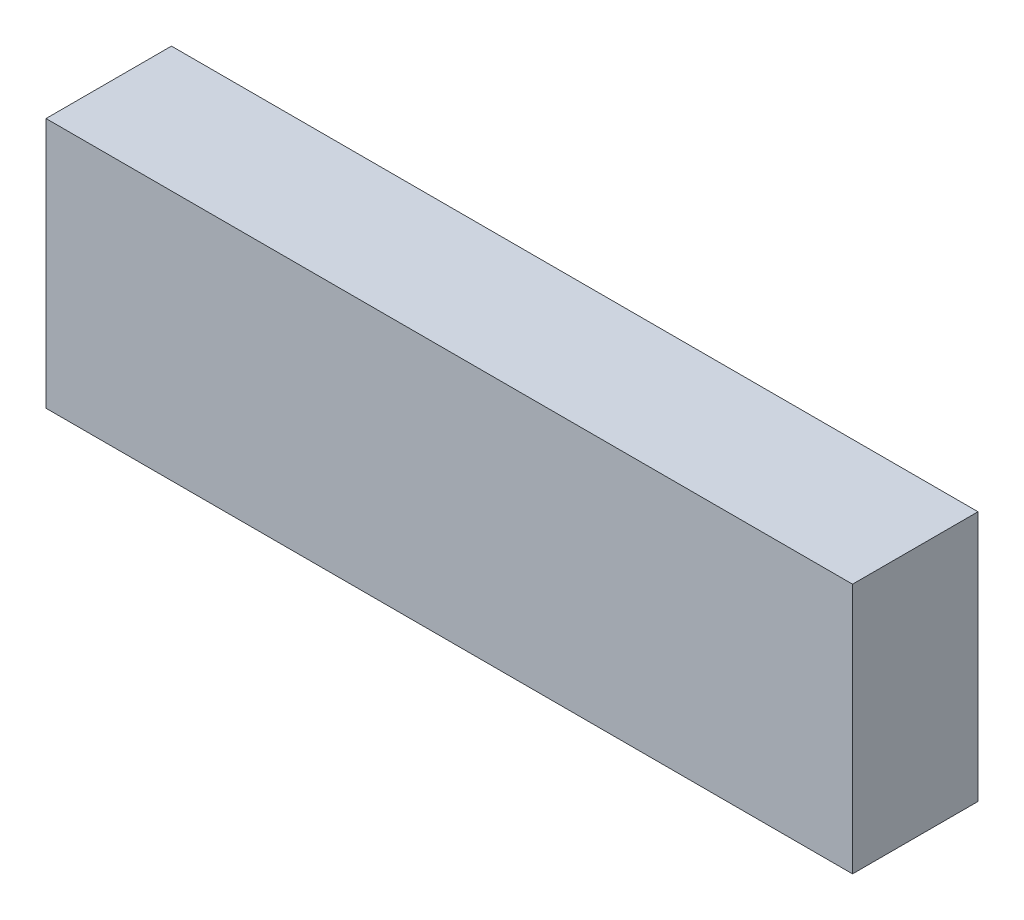
ISO-10303-21;
HEADER;
FILE_DESCRIPTION(('STEP AP214'),'2;1');
FILE_NAME('part.step','',(''),(''),'','','');
FILE_SCHEMA(('AUTOMOTIVE_DESIGN { 1 0 10303 214 1 1 1 1 }'));
ENDSEC;
DATA;
#1=APPLICATION_CONTEXT('core data for automotive mechanical design processes');
#2=APPLICATION_PROTOCOL_DEFINITION('international standard','automotive_design',2000,#1);
#3=PRODUCT_CONTEXT('',#1,'mechanical');
#4=PRODUCT('Part','Part','',(#3));
#5=PRODUCT_RELATED_PRODUCT_CATEGORY('part','',(#4));
#6=PRODUCT_DEFINITION_FORMATION('','',#4);
#7=PRODUCT_DEFINITION_CONTEXT('part definition',#1,'design');
#8=PRODUCT_DEFINITION('design','',#6,#7);
#9=PRODUCT_DEFINITION_SHAPE('','',#8);
#10=(LENGTH_UNIT() NAMED_UNIT(*) SI_UNIT(.MILLI.,.METRE.));
#11=(NAMED_UNIT(*) PLANE_ANGLE_UNIT() SI_UNIT($,.RADIAN.));
#12=(NAMED_UNIT(*) SI_UNIT($,.STERADIAN.) SOLID_ANGLE_UNIT());
#13=UNCERTAINTY_MEASURE_WITH_UNIT(LENGTH_MEASURE(1.E-05),#10,'distance_accuracy_value','');
#14=(GEOMETRIC_REPRESENTATION_CONTEXT(3) GLOBAL_UNCERTAINTY_ASSIGNED_CONTEXT((#13)) GLOBAL_UNIT_ASSIGNED_CONTEXT((#10,
#11,#12)) REPRESENTATION_CONTEXT('',''));
#15=CARTESIAN_POINT('',(0.,0.,0.));
#16=DIRECTION('',(0.,0.,1.));
#17=DIRECTION('',(1.,0.,0.));
#18=AXIS2_PLACEMENT_3D('',#15,#16,#17);
#19=CARTESIAN_POINT('',(-85.,106.,198.));
#20=DIRECTION('',(0.,0.,1.));
#21=DIRECTION('',(1.,0.,0.));
#22=AXIS2_PLACEMENT_3D('',#19,#20,#21);
#23=PLANE('',#22);
#24=DIRECTION('',(0.,1.,0.));
#25=VECTOR('',#24,1.);
#26=CARTESIAN_POINT('',(-85.,106.,198.));
#27=LINE('',#26,#25);
#28=CARTESIAN_POINT('',(-85.,106.,198.));
#29=VERTEX_POINT('',#28);
#30=CARTESIAN_POINT('',(-85.,134.,198.));
#31=VERTEX_POINT('',#30);
#32=EDGE_CURVE('E98',#29,#31,#27,.T.);
#33=ORIENTED_EDGE('',*,*,#32,.F.);
#34=DIRECTION('',(1.,0.,0.));
#35=VECTOR('',#34,1.);
#36=CARTESIAN_POINT('',(-85.,106.,198.));
#37=LINE('',#36,#35);
#38=CARTESIAN_POINT('',(5.,106.,198.));
#39=VERTEX_POINT('',#38);
#40=EDGE_CURVE('E81',#29,#39,#37,.T.);
#41=ORIENTED_EDGE('',*,*,#40,.T.);
#42=DIRECTION('',(0.,1.,0.));
#43=VECTOR('',#42,1.);
#44=CARTESIAN_POINT('',(5.,106.,198.));
#45=LINE('',#44,#43);
#46=CARTESIAN_POINT('',(5.,134.,198.));
#47=VERTEX_POINT('',#46);
#48=EDGE_CURVE('E107',#39,#47,#45,.T.);
#49=ORIENTED_EDGE('',*,*,#48,.T.);
#50=DIRECTION('',(1.,0.,0.));
#51=VECTOR('',#50,1.);
#52=CARTESIAN_POINT('',(-85.,134.,198.));
#53=LINE('',#52,#51);
#54=EDGE_CURVE('E10',#31,#47,#53,.T.);
#55=ORIENTED_EDGE('',*,*,#54,.F.);
#56=EDGE_LOOP('',(#33,#41,#49,#55));
#57=FACE_BOUND('',#56,.T.);
#58=ADVANCED_FACE('F15',(#57),#23,.T.);
#59=CARTESIAN_POINT('',(-85.,106.,184.));
#60=DIRECTION('',(0.,0.,1.));
#61=DIRECTION('',(1.,0.,0.));
#62=AXIS2_PLACEMENT_3D('',#59,#60,#61);
#63=PLANE('',#62);
#64=DIRECTION('',(1.,0.,0.));
#65=VECTOR('',#64,1.);
#66=CARTESIAN_POINT('',(-85.,134.,184.));
#67=LINE('',#66,#65);
#68=CARTESIAN_POINT('',(-85.,134.,184.));
#69=VERTEX_POINT('',#68);
#70=CARTESIAN_POINT('',(5.,134.,184.));
#71=VERTEX_POINT('',#70);
#72=EDGE_CURVE('E26',#69,#71,#67,.T.);
#73=ORIENTED_EDGE('',*,*,#72,.T.);
#74=DIRECTION('',(0.,1.,0.));
#75=VECTOR('',#74,1.);
#76=CARTESIAN_POINT('',(5.,106.,184.));
#77=LINE('',#76,#75);
#78=CARTESIAN_POINT('',(5.,106.,184.));
#79=VERTEX_POINT('',#78);
#80=EDGE_CURVE('E76',#79,#71,#77,.T.);
#81=ORIENTED_EDGE('',*,*,#80,.F.);
#82=DIRECTION('',(1.,0.,0.));
#83=VECTOR('',#82,1.);
#84=CARTESIAN_POINT('',(-85.,106.,184.));
#85=LINE('',#84,#83);
#86=CARTESIAN_POINT('',(-85.,106.,184.));
#87=VERTEX_POINT('',#86);
#88=EDGE_CURVE('E70',#87,#79,#85,.T.);
#89=ORIENTED_EDGE('',*,*,#88,.F.);
#90=DIRECTION('',(0.,1.,0.));
#91=VECTOR('',#90,1.);
#92=CARTESIAN_POINT('',(-85.,106.,184.));
#93=LINE('',#92,#91);
#94=EDGE_CURVE('E19',#87,#69,#93,.T.);
#95=ORIENTED_EDGE('',*,*,#94,.T.);
#96=EDGE_LOOP('',(#73,#81,#89,#95));
#97=FACE_BOUND('',#96,.T.);
#98=ADVANCED_FACE('F72',(#97),#63,.F.);
#99=CARTESIAN_POINT('',(-85.,134.,184.));
#100=DIRECTION('',(0.,1.,0.));
#101=DIRECTION('',(1.,0.,0.));
#102=AXIS2_PLACEMENT_3D('',#99,#100,#101);
#103=PLANE('',#102);
#104=ORIENTED_EDGE('',*,*,#72,.F.);
#105=DIRECTION('',(0.,0.,1.));
#106=VECTOR('',#105,1.);
#107=CARTESIAN_POINT('',(-85.,134.,184.));
#108=LINE('',#107,#106);
#109=EDGE_CURVE('E92',#69,#31,#108,.T.);
#110=ORIENTED_EDGE('',*,*,#109,.T.);
#111=ORIENTED_EDGE('',*,*,#54,.T.);
#112=DIRECTION('',(0.,0.,1.));
#113=VECTOR('',#112,1.);
#114=CARTESIAN_POINT('',(5.,134.,184.));
#115=LINE('',#114,#113);
#116=EDGE_CURVE('E105',#71,#47,#115,.T.);
#117=ORIENTED_EDGE('',*,*,#116,.F.);
#118=EDGE_LOOP('',(#104,#110,#111,#117));
#119=FACE_BOUND('',#118,.T.);
#120=ADVANCED_FACE('F127',(#119),#103,.T.);
#121=CARTESIAN_POINT('',(-85.,106.,184.));
#122=DIRECTION('',(0.,1.,0.));
#123=DIRECTION('',(1.,0.,0.));
#124=AXIS2_PLACEMENT_3D('',#121,#122,#123);
#125=PLANE('',#124);
#126=DIRECTION('',(0.,0.,1.));
#127=VECTOR('',#126,1.);
#128=CARTESIAN_POINT('',(5.,106.,184.));
#129=LINE('',#128,#127);
#130=EDGE_CURVE('E89',#79,#39,#129,.T.);
#131=ORIENTED_EDGE('',*,*,#130,.T.);
#132=ORIENTED_EDGE('',*,*,#40,.F.);
#133=DIRECTION('',(0.,0.,1.));
#134=VECTOR('',#133,1.);
#135=CARTESIAN_POINT('',(-85.,106.,184.));
#136=LINE('',#135,#134);
#137=EDGE_CURVE('E84',#87,#29,#136,.T.);
#138=ORIENTED_EDGE('',*,*,#137,.F.);
#139=ORIENTED_EDGE('',*,*,#88,.T.);
#140=EDGE_LOOP('',(#131,#132,#138,#139));
#141=FACE_BOUND('',#140,.T.);
#142=ADVANCED_FACE('F17',(#141),#125,.F.);
#143=CARTESIAN_POINT('',(5.,106.,184.));
#144=DIRECTION('',(1.,0.,0.));
#145=DIRECTION('',(0.,1.,0.));
#146=AXIS2_PLACEMENT_3D('',#143,#144,#145);
#147=PLANE('',#146);
#148=ORIENTED_EDGE('',*,*,#130,.F.);
#149=ORIENTED_EDGE('',*,*,#80,.T.);
#150=ORIENTED_EDGE('',*,*,#116,.T.);
#151=ORIENTED_EDGE('',*,*,#48,.F.);
#152=EDGE_LOOP('',(#148,#149,#150,#151));
#153=FACE_BOUND('',#152,.T.);
#154=ADVANCED_FACE('F118',(#153),#147,.T.);
#155=CARTESIAN_POINT('',(-85.,106.,184.));
#156=DIRECTION('',(1.,0.,0.));
#157=DIRECTION('',(0.,1.,0.));
#158=AXIS2_PLACEMENT_3D('',#155,#156,#157);
#159=PLANE('',#158);
#160=ORIENTED_EDGE('',*,*,#32,.T.);
#161=ORIENTED_EDGE('',*,*,#109,.F.);
#162=ORIENTED_EDGE('',*,*,#94,.F.);
#163=ORIENTED_EDGE('',*,*,#137,.T.);
#164=EDGE_LOOP('',(#160,#161,#162,#163));
#165=FACE_BOUND('',#164,.T.);
#166=ADVANCED_FACE('F91',(#165),#159,.F.);
#167=CLOSED_SHELL('',(#58,#98,#120,#142,#154,#166));
#168=MANIFOLD_SOLID_BREP('B1',#167);
#169=ADVANCED_BREP_SHAPE_REPRESENTATION('',(#18,#168),#14);
#170=SHAPE_DEFINITION_REPRESENTATION(#9,#169);
ENDSEC;
END-ISO-10303-21;
